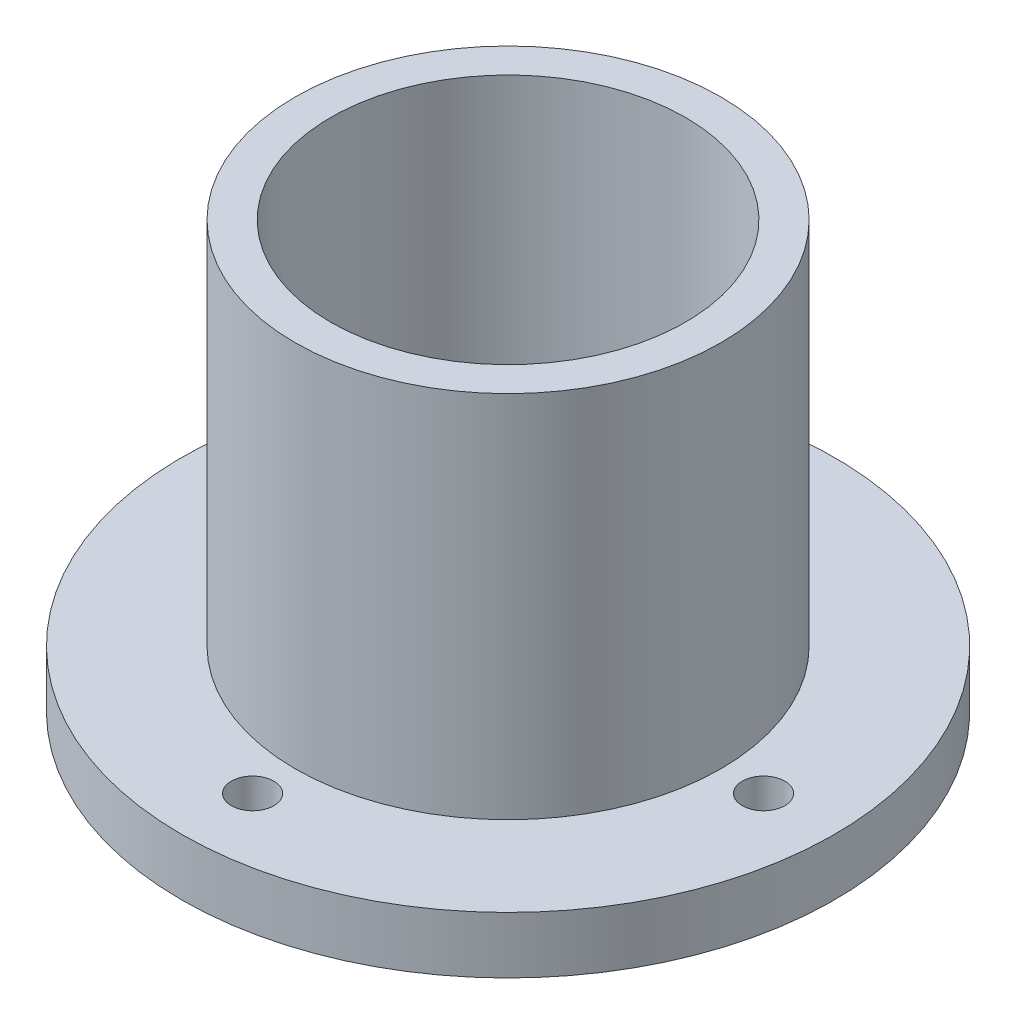
ISO-10303-21;
HEADER;
FILE_DESCRIPTION(('STEP AP214'),'2;1');
FILE_NAME('part.step','',(''),(''),'','','');
FILE_SCHEMA(('AUTOMOTIVE_DESIGN { 1 0 10303 214 1 1 1 1 }'));
ENDSEC;
DATA;
#1=APPLICATION_CONTEXT('core data for automotive mechanical design processes');
#2=APPLICATION_PROTOCOL_DEFINITION('international standard','automotive_design',2000,#1);
#3=PRODUCT_CONTEXT('',#1,'mechanical');
#4=PRODUCT('Part','Part','',(#3));
#5=PRODUCT_RELATED_PRODUCT_CATEGORY('part','',(#4));
#6=PRODUCT_DEFINITION_FORMATION('','',#4);
#7=PRODUCT_DEFINITION_CONTEXT('part definition',#1,'design');
#8=PRODUCT_DEFINITION('design','',#6,#7);
#9=PRODUCT_DEFINITION_SHAPE('','',#8);
#10=(LENGTH_UNIT() NAMED_UNIT(*) SI_UNIT(.MILLI.,.METRE.));
#11=(NAMED_UNIT(*) PLANE_ANGLE_UNIT() SI_UNIT($,.RADIAN.));
#12=(NAMED_UNIT(*) SI_UNIT($,.STERADIAN.) SOLID_ANGLE_UNIT());
#13=UNCERTAINTY_MEASURE_WITH_UNIT(LENGTH_MEASURE(1.E-05),#10,'distance_accuracy_value','');
#14=(GEOMETRIC_REPRESENTATION_CONTEXT(3) GLOBAL_UNCERTAINTY_ASSIGNED_CONTEXT((#13)) GLOBAL_UNIT_ASSIGNED_CONTEXT((#10,
#11,#12)) REPRESENTATION_CONTEXT('',''));
#15=CARTESIAN_POINT('',(0.,0.,0.));
#16=DIRECTION('',(0.,0.,1.));
#17=DIRECTION('',(1.,0.,0.));
#18=AXIS2_PLACEMENT_3D('',#15,#16,#17);
#19=CARTESIAN_POINT('',(0.,30.,0.));
#20=DIRECTION('',(0.,-1.,0.));
#21=DIRECTION('',(0.,0.,-1.));
#22=AXIS2_PLACEMENT_3D('',#19,#20,#21);
#23=CYLINDRICAL_SURFACE('',#22,12.5);
#24=CARTESIAN_POINT('',(0.,30.,0.));
#25=DIRECTION('',(0.,1.,0.));
#26=DIRECTION('',(0.,0.,1.));
#27=AXIS2_PLACEMENT_3D('',#24,#25,#26);
#28=CIRCLE('',#27,12.5);
#29=CARTESIAN_POINT('',(0.,30.,12.5));
#30=VERTEX_POINT('',#29);
#31=EDGE_CURVE('E40',#30,#30,#28,.T.);
#32=ORIENTED_EDGE('',*,*,#31,.T.);
#33=EDGE_LOOP('',(#32));
#34=FACE_BOUND('',#33,.T.);
#35=CARTESIAN_POINT('',(0.,0.,0.));
#36=DIRECTION('',(0.,1.,0.));
#37=DIRECTION('',(0.,0.,1.));
#38=AXIS2_PLACEMENT_3D('',#35,#36,#37);
#39=CIRCLE('',#38,12.5);
#40=CARTESIAN_POINT('',(0.,0.,12.5));
#41=VERTEX_POINT('',#40);
#42=EDGE_CURVE('E36',#41,#41,#39,.T.);
#43=ORIENTED_EDGE('',*,*,#42,.F.);
#44=EDGE_LOOP('',(#43));
#45=FACE_BOUND('',#44,.T.);
#46=ADVANCED_FACE('F33',(#34,#45),#23,.F.);
#47=CARTESIAN_POINT('',(0.,30.,0.));
#48=DIRECTION('',(0.,-1.,0.));
#49=DIRECTION('',(0.,0.,-1.));
#50=AXIS2_PLACEMENT_3D('',#47,#48,#49);
#51=CYLINDRICAL_SURFACE('',#50,15.);
#52=CARTESIAN_POINT('',(0.,4.,0.));
#53=DIRECTION('',(0.,1.,0.));
#54=DIRECTION('',(0.,0.,1.));
#55=AXIS2_PLACEMENT_3D('',#52,#53,#54);
#56=CIRCLE('',#55,15.);
#57=CARTESIAN_POINT('',(0.,4.,15.));
#58=VERTEX_POINT('',#57);
#59=EDGE_CURVE('E49',#58,#58,#56,.T.);
#60=ORIENTED_EDGE('',*,*,#59,.T.);
#61=EDGE_LOOP('',(#60));
#62=FACE_BOUND('',#61,.T.);
#63=CARTESIAN_POINT('',(0.,30.,0.));
#64=DIRECTION('',(0.,1.,0.));
#65=DIRECTION('',(0.,0.,1.));
#66=AXIS2_PLACEMENT_3D('',#63,#64,#65);
#67=CIRCLE('',#66,15.);
#68=CARTESIAN_POINT('',(0.,30.,15.));
#69=VERTEX_POINT('',#68);
#70=EDGE_CURVE('E10',#69,#69,#67,.T.);
#71=ORIENTED_EDGE('',*,*,#70,.F.);
#72=EDGE_LOOP('',(#71));
#73=FACE_BOUND('',#72,.T.);
#74=ADVANCED_FACE('F112',(#62,#73),#51,.T.);
#75=CARTESIAN_POINT('',(0.,30.,0.));
#76=DIRECTION('',(0.,1.,0.));
#77=DIRECTION('',(0.,0.,1.));
#78=AXIS2_PLACEMENT_3D('',#75,#76,#77);
#79=PLANE('',#78);
#80=ORIENTED_EDGE('',*,*,#31,.F.);
#81=EDGE_LOOP('',(#80));
#82=FACE_BOUND('',#81,.T.);
#83=ORIENTED_EDGE('',*,*,#70,.T.);
#84=EDGE_LOOP('',(#83));
#85=FACE_BOUND('',#84,.T.);
#86=ADVANCED_FACE('F86',(#82,#85),#79,.T.);
#87=CARTESIAN_POINT('',(0.,0.,0.));
#88=DIRECTION('',(0.,1.,0.));
#89=DIRECTION('',(0.,0.,1.));
#90=AXIS2_PLACEMENT_3D('',#87,#88,#89);
#91=PLANE('',#90);
#92=CARTESIAN_POINT('',(0.,0.,18.));
#93=DIRECTION('',(0.,-1.,0.));
#94=DIRECTION('',(0.,0.,-1.));
#95=AXIS2_PLACEMENT_3D('',#92,#93,#94);
#96=CIRCLE('',#95,1.5);
#97=CARTESIAN_POINT('',(0.,0.,16.5));
#98=VERTEX_POINT('',#97);
#99=EDGE_CURVE('E50',#98,#98,#96,.T.);
#100=ORIENTED_EDGE('',*,*,#99,.F.);
#101=EDGE_LOOP('',(#100));
#102=FACE_BOUND('',#101,.T.);
#103=CARTESIAN_POINT('',(18.0000000000005,0.,5.09386405508807E-13));
#104=DIRECTION('',(0.,-1.,0.));
#105=DIRECTION('',(0.,0.,-1.));
#106=AXIS2_PLACEMENT_3D('',#103,#104,#105);
#107=CIRCLE('',#106,1.5000000000004);
#108=CARTESIAN_POINT('',(18.0000000000005,0.,-1.49999999999989));
#109=VERTEX_POINT('',#108);
#110=EDGE_CURVE('E71',#109,#109,#107,.T.);
#111=ORIENTED_EDGE('',*,*,#110,.F.);
#112=EDGE_LOOP('',(#111));
#113=FACE_BOUND('',#112,.T.);
#114=CARTESIAN_POINT('',(1.01877281101761E-12,0.,-18.));
#115=DIRECTION('',(0.,-1.,0.));
#116=DIRECTION('',(0.,0.,-1.));
#117=AXIS2_PLACEMENT_3D('',#114,#115,#116);
#118=CIRCLE('',#117,1.50000000000109);
#119=CARTESIAN_POINT('',(1.01877281101761E-12,0.,-19.5000000000011));
#120=VERTEX_POINT('',#119);
#121=EDGE_CURVE('E65',#120,#120,#118,.T.);
#122=ORIENTED_EDGE('',*,*,#121,.F.);
#123=EDGE_LOOP('',(#122));
#124=FACE_BOUND('',#123,.T.);
#125=CARTESIAN_POINT('',(-17.9999999999995,0.,-5.11590769747272E-13));
#126=DIRECTION('',(0.,-1.,0.));
#127=DIRECTION('',(0.,0.,-1.));
#128=AXIS2_PLACEMENT_3D('',#125,#126,#127);
#129=CIRCLE('',#128,1.50000000000082);
#130=CARTESIAN_POINT('',(-17.9999999999995,0.,-1.50000000000133));
#131=VERTEX_POINT('',#130);
#132=EDGE_CURVE('E59',#131,#131,#129,.T.);
#133=ORIENTED_EDGE('',*,*,#132,.F.);
#134=EDGE_LOOP('',(#133));
#135=FACE_BOUND('',#134,.T.);
#136=ORIENTED_EDGE('',*,*,#42,.T.);
#137=EDGE_LOOP('',(#136));
#138=FACE_BOUND('',#137,.T.);
#139=CARTESIAN_POINT('',(0.,0.,0.));
#140=DIRECTION('',(0.,1.,0.));
#141=DIRECTION('',(0.,0.,1.));
#142=AXIS2_PLACEMENT_3D('',#139,#140,#141);
#143=CIRCLE('',#142,23.);
#144=CARTESIAN_POINT('',(0.,0.,23.));
#145=VERTEX_POINT('',#144);
#146=EDGE_CURVE('E46',#145,#145,#143,.T.);
#147=ORIENTED_EDGE('',*,*,#146,.F.);
#148=EDGE_LOOP('',(#147));
#149=FACE_BOUND('',#148,.T.);
#150=ADVANCED_FACE('F82',(#102,#113,#124,#135,#138,#149),#91,.F.);
#151=CARTESIAN_POINT('',(0.,4.,0.));
#152=DIRECTION('',(0.,-1.,0.));
#153=DIRECTION('',(0.,0.,-1.));
#154=AXIS2_PLACEMENT_3D('',#151,#152,#153);
#155=CYLINDRICAL_SURFACE('',#154,23.);
#156=CARTESIAN_POINT('',(0.,4.,0.));
#157=DIRECTION('',(0.,1.,0.));
#158=DIRECTION('',(0.,0.,1.));
#159=AXIS2_PLACEMENT_3D('',#156,#157,#158);
#160=CIRCLE('',#159,23.);
#161=CARTESIAN_POINT('',(0.,4.,23.));
#162=VERTEX_POINT('',#161);
#163=EDGE_CURVE('E51',#162,#162,#160,.T.);
#164=ORIENTED_EDGE('',*,*,#163,.F.);
#165=EDGE_LOOP('',(#164));
#166=FACE_BOUND('',#165,.T.);
#167=ORIENTED_EDGE('',*,*,#146,.T.);
#168=EDGE_LOOP('',(#167));
#169=FACE_BOUND('',#168,.T.);
#170=ADVANCED_FACE('F85',(#166,#169),#155,.T.);
#171=CARTESIAN_POINT('',(0.,4.,0.));
#172=DIRECTION('',(0.,1.,0.));
#173=DIRECTION('',(0.,0.,1.));
#174=AXIS2_PLACEMENT_3D('',#171,#172,#173);
#175=PLANE('',#174);
#176=CARTESIAN_POINT('',(0.,4.,18.));
#177=DIRECTION('',(0.,1.,0.));
#178=DIRECTION('',(0.,0.,1.));
#179=AXIS2_PLACEMENT_3D('',#176,#177,#178);
#180=CIRCLE('',#179,1.5);
#181=CARTESIAN_POINT('',(0.,4.,19.5));
#182=VERTEX_POINT('',#181);
#183=EDGE_CURVE('E74',#182,#182,#180,.F.);
#184=ORIENTED_EDGE('',*,*,#183,.T.);
#185=EDGE_LOOP('',(#184));
#186=FACE_BOUND('',#185,.T.);
#187=CARTESIAN_POINT('',(18.0000000000005,4.,5.09386405508807E-13));
#188=DIRECTION('',(0.,1.,0.));
#189=DIRECTION('',(0.,0.,1.));
#190=AXIS2_PLACEMENT_3D('',#187,#188,#189);
#191=CIRCLE('',#190,1.5000000000004);
#192=CARTESIAN_POINT('',(18.0000000000005,4.,1.50000000000091));
#193=VERTEX_POINT('',#192);
#194=EDGE_CURVE('E68',#193,#193,#191,.F.);
#195=ORIENTED_EDGE('',*,*,#194,.T.);
#196=EDGE_LOOP('',(#195));
#197=FACE_BOUND('',#196,.T.);
#198=CARTESIAN_POINT('',(1.01877281101761E-12,4.,-18.));
#199=DIRECTION('',(0.,1.,0.));
#200=DIRECTION('',(0.,0.,1.));
#201=AXIS2_PLACEMENT_3D('',#198,#199,#200);
#202=CIRCLE('',#201,1.50000000000109);
#203=CARTESIAN_POINT('',(1.01877281101761E-12,4.,-16.4999999999989));
#204=VERTEX_POINT('',#203);
#205=EDGE_CURVE('E62',#204,#204,#202,.F.);
#206=ORIENTED_EDGE('',*,*,#205,.T.);
#207=EDGE_LOOP('',(#206));
#208=FACE_BOUND('',#207,.T.);
#209=CARTESIAN_POINT('',(-17.9999999999995,4.,-5.11590769747272E-13));
#210=DIRECTION('',(0.,1.,0.));
#211=DIRECTION('',(0.,0.,1.));
#212=AXIS2_PLACEMENT_3D('',#209,#210,#211);
#213=CIRCLE('',#212,1.50000000000082);
#214=CARTESIAN_POINT('',(-17.9999999999995,4.,1.50000000000031));
#215=VERTEX_POINT('',#214);
#216=EDGE_CURVE('E56',#215,#215,#213,.F.);
#217=ORIENTED_EDGE('',*,*,#216,.T.);
#218=EDGE_LOOP('',(#217));
#219=FACE_BOUND('',#218,.T.);
#220=ORIENTED_EDGE('',*,*,#59,.F.);
#221=EDGE_LOOP('',(#220));
#222=FACE_BOUND('',#221,.T.);
#223=ORIENTED_EDGE('',*,*,#163,.T.);
#224=EDGE_LOOP('',(#223));
#225=FACE_BOUND('',#224,.T.);
#226=ADVANCED_FACE('F100',(#186,#197,#208,#219,#222,#225),#175,.T.);
#227=CARTESIAN_POINT('',(-17.9999999999995,30.001,-5.11590769747272E-13));
#228=DIRECTION('',(0.,-1.,0.));
#229=DIRECTION('',(0.,0.,-1.));
#230=AXIS2_PLACEMENT_3D('',#227,#228,#229);
#231=CYLINDRICAL_SURFACE('',#230,1.50000000000082);
#232=ORIENTED_EDGE('',*,*,#216,.F.);
#233=EDGE_LOOP('',(#232));
#234=FACE_BOUND('',#233,.T.);
#235=ORIENTED_EDGE('',*,*,#132,.T.);
#236=EDGE_LOOP('',(#235));
#237=FACE_BOUND('',#236,.T.);
#238=ADVANCED_FACE('F106',(#234,#237),#231,.F.);
#239=CARTESIAN_POINT('',(1.01877281101761E-12,30.001,-18.));
#240=DIRECTION('',(0.,-1.,0.));
#241=DIRECTION('',(0.,0.,-1.));
#242=AXIS2_PLACEMENT_3D('',#239,#240,#241);
#243=CYLINDRICAL_SURFACE('',#242,1.50000000000109);
#244=ORIENTED_EDGE('',*,*,#205,.F.);
#245=EDGE_LOOP('',(#244));
#246=FACE_BOUND('',#245,.T.);
#247=ORIENTED_EDGE('',*,*,#121,.T.);
#248=EDGE_LOOP('',(#247));
#249=FACE_BOUND('',#248,.T.);
#250=ADVANCED_FACE('F148',(#246,#249),#243,.F.);
#251=CARTESIAN_POINT('',(18.0000000000005,30.001,5.09386405508807E-13));
#252=DIRECTION('',(0.,-1.,0.));
#253=DIRECTION('',(0.,0.,-1.));
#254=AXIS2_PLACEMENT_3D('',#251,#252,#253);
#255=CYLINDRICAL_SURFACE('',#254,1.5000000000004);
#256=ORIENTED_EDGE('',*,*,#194,.F.);
#257=EDGE_LOOP('',(#256));
#258=FACE_BOUND('',#257,.T.);
#259=ORIENTED_EDGE('',*,*,#110,.T.);
#260=EDGE_LOOP('',(#259));
#261=FACE_BOUND('',#260,.T.);
#262=ADVANCED_FACE('F158',(#258,#261),#255,.F.);
#263=CARTESIAN_POINT('',(0.,30.001,18.));
#264=DIRECTION('',(0.,-1.,0.));
#265=DIRECTION('',(0.,0.,-1.));
#266=AXIS2_PLACEMENT_3D('',#263,#264,#265);
#267=CYLINDRICAL_SURFACE('',#266,1.5);
#268=ORIENTED_EDGE('',*,*,#183,.F.);
#269=EDGE_LOOP('',(#268));
#270=FACE_BOUND('',#269,.T.);
#271=ORIENTED_EDGE('',*,*,#99,.T.);
#272=EDGE_LOOP('',(#271));
#273=FACE_BOUND('',#272,.T.);
#274=ADVANCED_FACE('F80',(#270,#273),#267,.F.);
#275=CLOSED_SHELL('',(#46,#74,#86,#150,#170,#226,#238,#250,#262,#274));
#276=MANIFOLD_SOLID_BREP('B2',#275);
#277=ADVANCED_BREP_SHAPE_REPRESENTATION('',(#18,#276),#14);
#278=SHAPE_DEFINITION_REPRESENTATION(#9,#277);
ENDSEC;
END-ISO-10303-21;
